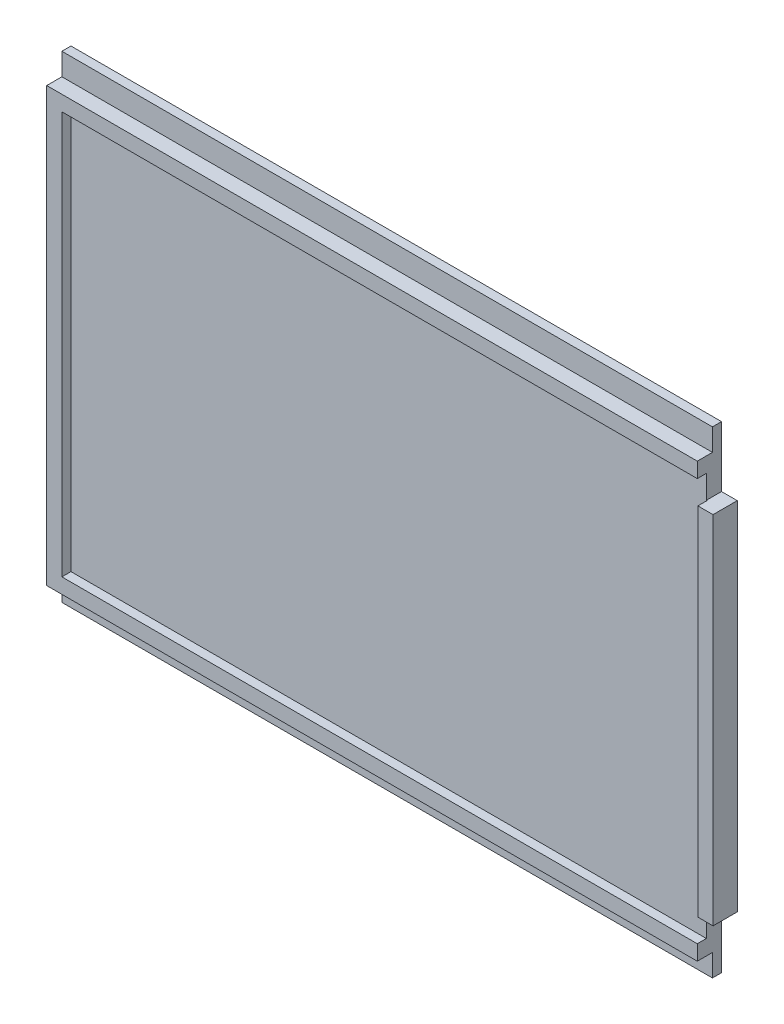
ISO-10303-21;
HEADER;
FILE_DESCRIPTION(('STEP AP214'),'2;1');
FILE_NAME('part.step','',(''),(''),'','','');
FILE_SCHEMA(('AUTOMOTIVE_DESIGN { 1 0 10303 214 1 1 1 1 }'));
ENDSEC;
DATA;
#1=APPLICATION_CONTEXT('core data for automotive mechanical design processes');
#2=APPLICATION_PROTOCOL_DEFINITION('international standard','automotive_design',2000,#1);
#3=PRODUCT_CONTEXT('',#1,'mechanical');
#4=PRODUCT('Part','Part','',(#3));
#5=PRODUCT_RELATED_PRODUCT_CATEGORY('part','',(#4));
#6=PRODUCT_DEFINITION_FORMATION('','',#4);
#7=PRODUCT_DEFINITION_CONTEXT('part definition',#1,'design');
#8=PRODUCT_DEFINITION('design','',#6,#7);
#9=PRODUCT_DEFINITION_SHAPE('','',#8);
#10=(LENGTH_UNIT() NAMED_UNIT(*) SI_UNIT(.MILLI.,.METRE.));
#11=(NAMED_UNIT(*) PLANE_ANGLE_UNIT() SI_UNIT($,.RADIAN.));
#12=(NAMED_UNIT(*) SI_UNIT($,.STERADIAN.) SOLID_ANGLE_UNIT());
#13=UNCERTAINTY_MEASURE_WITH_UNIT(LENGTH_MEASURE(1.E-05),#10,'distance_accuracy_value','');
#14=(GEOMETRIC_REPRESENTATION_CONTEXT(3) GLOBAL_UNCERTAINTY_ASSIGNED_CONTEXT((#13)) GLOBAL_UNIT_ASSIGNED_CONTEXT((#10,
#11,#12)) REPRESENTATION_CONTEXT('',''));
#15=CARTESIAN_POINT('',(0.,0.,0.));
#16=DIRECTION('',(0.,0.,1.));
#17=DIRECTION('',(1.,0.,0.));
#18=AXIS2_PLACEMENT_3D('',#15,#16,#17);
#19=CARTESIAN_POINT('',(0.,0.,5.));
#20=DIRECTION('',(0.,0.,1.));
#21=DIRECTION('',(1.,0.,0.));
#22=AXIS2_PLACEMENT_3D('',#19,#20,#21);
#23=PLANE('',#22);
#24=DIRECTION('',(0.,1.,0.));
#25=VECTOR('',#24,1.);
#26=CARTESIAN_POINT('',(104.8,78.8,5.));
#27=LINE('',#26,#25);
#28=CARTESIAN_POINT('',(104.8,66.5,5.));
#29=VERTEX_POINT('',#28);
#30=CARTESIAN_POINT('',(104.8,71.5,5.));
#31=VERTEX_POINT('',#30);
#32=EDGE_CURVE('E183',#29,#31,#27,.T.);
#33=ORIENTED_EDGE('',*,*,#32,.T.);
#34=DIRECTION('',(-1.,0.,0.));
#35=VECTOR('',#34,1.);
#36=CARTESIAN_POINT('',(-110.,71.5,5.));
#37=LINE('',#36,#35);
#38=CARTESIAN_POINT('',(-110.,71.5,5.));
#39=VERTEX_POINT('',#38);
#40=EDGE_CURVE('E200',#31,#39,#37,.T.);
#41=ORIENTED_EDGE('',*,*,#40,.T.);
#42=DIRECTION('',(0.,-1.,0.));
#43=VECTOR('',#42,1.);
#44=CARTESIAN_POINT('',(-110.,71.5,5.));
#45=LINE('',#44,#43);
#46=CARTESIAN_POINT('',(-110.,-71.5,5.));
#47=VERTEX_POINT('',#46);
#48=EDGE_CURVE('E205',#39,#47,#45,.T.);
#49=ORIENTED_EDGE('',*,*,#48,.T.);
#50=DIRECTION('',(1.,0.,0.));
#51=VECTOR('',#50,1.);
#52=CARTESIAN_POINT('',(-110.,-71.5,5.));
#53=LINE('',#52,#51);
#54=CARTESIAN_POINT('',(104.8,-71.5,5.));
#55=VERTEX_POINT('',#54);
#56=EDGE_CURVE('E216',#47,#55,#53,.T.);
#57=ORIENTED_EDGE('',*,*,#56,.T.);
#58=DIRECTION('',(0.,1.,0.));
#59=VECTOR('',#58,1.);
#60=CARTESIAN_POINT('',(104.8,-58.8,5.));
#61=LINE('',#60,#59);
#62=CARTESIAN_POINT('',(104.8,-66.5,5.));
#63=VERTEX_POINT('',#62);
#64=EDGE_CURVE('E317',#55,#63,#61,.T.);
#65=ORIENTED_EDGE('',*,*,#64,.T.);
#66=DIRECTION('',(1.,0.,0.));
#67=VECTOR('',#66,1.);
#68=CARTESIAN_POINT('',(105.,-66.5,5.));
#69=LINE('',#68,#67);
#70=CARTESIAN_POINT('',(-105.,-66.5,5.));
#71=VERTEX_POINT('',#70);
#72=EDGE_CURVE('E292',#71,#63,#69,.T.);
#73=ORIENTED_EDGE('',*,*,#72,.F.);
#74=DIRECTION('',(0.,-1.,0.));
#75=VECTOR('',#74,1.);
#76=CARTESIAN_POINT('',(-105.,-66.5,5.));
#77=LINE('',#76,#75);
#78=CARTESIAN_POINT('',(-105.,66.5,5.));
#79=VERTEX_POINT('',#78);
#80=EDGE_CURVE('E273',#79,#71,#77,.T.);
#81=ORIENTED_EDGE('',*,*,#80,.F.);
#82=DIRECTION('',(-1.,0.,0.));
#83=VECTOR('',#82,1.);
#84=CARTESIAN_POINT('',(105.,66.5,5.));
#85=LINE('',#84,#83);
#86=EDGE_CURVE('E279',#29,#79,#85,.T.);
#87=ORIENTED_EDGE('',*,*,#86,.F.);
#88=EDGE_LOOP('',(#33,#41,#49,#57,#65,#73,#81,#87));
#89=FACE_BOUND('',#88,.T.);
#90=ADVANCED_FACE('F45',(#89),#23,.T.);
#91=CARTESIAN_POINT('',(110.,71.5,5.));
#92=DIRECTION('',(-1.,0.,0.));
#93=DIRECTION('',(0.,-1.,0.));
#94=AXIS2_PLACEMENT_3D('',#91,#92,#93);
#95=PLANE('',#94);
#96=DIRECTION('',(0.,-1.,0.));
#97=VECTOR('',#96,1.);
#98=CARTESIAN_POINT('',(110.,78.8,-3.));
#99=LINE('',#98,#97);
#100=CARTESIAN_POINT('',(110.,58.8,-3.));
#101=VERTEX_POINT('',#100);
#102=CARTESIAN_POINT('',(110.,-58.8,-3.));
#103=VERTEX_POINT('',#102);
#104=EDGE_CURVE('E192',#101,#103,#99,.T.);
#105=ORIENTED_EDGE('',*,*,#104,.F.);
#106=DIRECTION('',(0.,0.,-1.));
#107=VECTOR('',#106,1.);
#108=CARTESIAN_POINT('',(110.,58.8,5.));
#109=LINE('',#108,#107);
#110=CARTESIAN_POINT('',(110.,58.8,5.));
#111=VERTEX_POINT('',#110);
#112=EDGE_CURVE('E174',#111,#101,#109,.T.);
#113=ORIENTED_EDGE('',*,*,#112,.F.);
#114=DIRECTION('',(0.,1.,0.));
#115=VECTOR('',#114,1.);
#116=CARTESIAN_POINT('',(110.,71.5,5.));
#117=LINE('',#116,#115);
#118=CARTESIAN_POINT('',(110.,-58.8,5.));
#119=VERTEX_POINT('',#118);
#120=EDGE_CURVE('E190',#119,#111,#117,.T.);
#121=ORIENTED_EDGE('',*,*,#120,.F.);
#122=DIRECTION('',(0.,0.,-1.));
#123=VECTOR('',#122,1.);
#124=CARTESIAN_POINT('',(110.,-58.8,5.));
#125=LINE('',#124,#123);
#126=EDGE_CURVE('E396',#119,#103,#125,.T.);
#127=ORIENTED_EDGE('',*,*,#126,.T.);
#128=EDGE_LOOP('',(#105,#113,#121,#127));
#129=FACE_BOUND('',#128,.T.);
#130=ADVANCED_FACE('F47',(#129),#95,.F.);
#131=CARTESIAN_POINT('',(-110.,71.5,5.));
#132=DIRECTION('',(0.,-1.,0.));
#133=DIRECTION('',(0.,0.,-1.));
#134=AXIS2_PLACEMENT_3D('',#131,#132,#133);
#135=PLANE('',#134);
#136=ORIENTED_EDGE('',*,*,#40,.F.);
#137=DIRECTION('',(0.,0.,-1.));
#138=VECTOR('',#137,1.);
#139=CARTESIAN_POINT('',(104.8,71.5,5.));
#140=LINE('',#139,#138);
#141=CARTESIAN_POINT('',(104.8,71.5,0.));
#142=VERTEX_POINT('',#141);
#143=EDGE_CURVE('E242',#31,#142,#140,.T.);
#144=ORIENTED_EDGE('',*,*,#143,.T.);
#145=DIRECTION('',(-1.,0.,0.));
#146=VECTOR('',#145,1.);
#147=CARTESIAN_POINT('',(-110.,71.5,0.));
#148=LINE('',#147,#146);
#149=CARTESIAN_POINT('',(-110.,71.5,0.));
#150=VERTEX_POINT('',#149);
#151=EDGE_CURVE('E208',#142,#150,#148,.T.);
#152=ORIENTED_EDGE('',*,*,#151,.T.);
#153=DIRECTION('',(0.,0.,-1.));
#154=VECTOR('',#153,1.);
#155=CARTESIAN_POINT('',(-110.,71.5,5.));
#156=LINE('',#155,#154);
#157=EDGE_CURVE('E54',#39,#150,#156,.T.);
#158=ORIENTED_EDGE('',*,*,#157,.F.);
#159=EDGE_LOOP('',(#136,#144,#152,#158));
#160=FACE_BOUND('',#159,.T.);
#161=ADVANCED_FACE('F239',(#160),#135,.F.);
#162=CARTESIAN_POINT('',(-110.,71.5,5.));
#163=DIRECTION('',(1.,0.,0.));
#164=DIRECTION('',(0.,1.,0.));
#165=AXIS2_PLACEMENT_3D('',#162,#163,#164);
#166=PLANE('',#165);
#167=ORIENTED_EDGE('',*,*,#157,.T.);
#168=DIRECTION('',(0.,1.,0.));
#169=VECTOR('',#168,1.);
#170=CARTESIAN_POINT('',(-110.,78.8,0.));
#171=LINE('',#170,#169);
#172=CARTESIAN_POINT('',(-110.,78.8,0.));
#173=VERTEX_POINT('',#172);
#174=EDGE_CURVE('E234',#150,#173,#171,.T.);
#175=ORIENTED_EDGE('',*,*,#174,.T.);
#176=DIRECTION('',(0.,0.,1.));
#177=VECTOR('',#176,1.);
#178=CARTESIAN_POINT('',(-110.,78.8,-3.));
#179=LINE('',#178,#177);
#180=CARTESIAN_POINT('',(-110.,78.8,-3.));
#181=VERTEX_POINT('',#180);
#182=EDGE_CURVE('E270',#181,#173,#179,.T.);
#183=ORIENTED_EDGE('',*,*,#182,.F.);
#184=DIRECTION('',(0.,1.,0.));
#185=VECTOR('',#184,1.);
#186=CARTESIAN_POINT('',(-110.,78.8,-3.));
#187=LINE('',#186,#185);
#188=CARTESIAN_POINT('',(-110.,-78.8,-3.));
#189=VERTEX_POINT('',#188);
#190=EDGE_CURVE('E265',#189,#181,#187,.T.);
#191=ORIENTED_EDGE('',*,*,#190,.F.);
#192=DIRECTION('',(0.,0.,1.));
#193=VECTOR('',#192,1.);
#194=CARTESIAN_POINT('',(-110.,-78.8,-3.));
#195=LINE('',#194,#193);
#196=CARTESIAN_POINT('',(-110.,-78.8,0.));
#197=VERTEX_POINT('',#196);
#198=EDGE_CURVE('E266',#189,#197,#195,.T.);
#199=ORIENTED_EDGE('',*,*,#198,.T.);
#200=CARTESIAN_POINT('',(-110.,-71.5,0.));
#201=VERTEX_POINT('',#200);
#202=EDGE_CURVE('E249',#197,#201,#171,.T.);
#203=ORIENTED_EDGE('',*,*,#202,.T.);
#204=DIRECTION('',(0.,0.,-1.));
#205=VECTOR('',#204,1.);
#206=CARTESIAN_POINT('',(-110.,-71.5,5.));
#207=LINE('',#206,#205);
#208=EDGE_CURVE('E220',#47,#201,#207,.T.);
#209=ORIENTED_EDGE('',*,*,#208,.F.);
#210=ORIENTED_EDGE('',*,*,#48,.F.);
#211=EDGE_LOOP('',(#167,#175,#183,#191,#199,#203,#209,#210));
#212=FACE_BOUND('',#211,.T.);
#213=ADVANCED_FACE('F231',(#212),#166,.F.);
#214=CARTESIAN_POINT('',(-110.,-71.5,5.));
#215=DIRECTION('',(0.,1.,0.));
#216=DIRECTION('',(0.,0.,1.));
#217=AXIS2_PLACEMENT_3D('',#214,#215,#216);
#218=PLANE('',#217);
#219=DIRECTION('',(1.,0.,0.));
#220=VECTOR('',#219,1.);
#221=CARTESIAN_POINT('',(-110.,-71.5,0.));
#222=LINE('',#221,#220);
#223=CARTESIAN_POINT('',(104.8,-71.5,0.));
#224=VERTEX_POINT('',#223);
#225=EDGE_CURVE('E201',#201,#224,#222,.T.);
#226=ORIENTED_EDGE('',*,*,#225,.T.);
#227=DIRECTION('',(0.,0.,1.));
#228=VECTOR('',#227,1.);
#229=CARTESIAN_POINT('',(104.8,-71.5,5.));
#230=LINE('',#229,#228);
#231=EDGE_CURVE('E350',#224,#55,#230,.T.);
#232=ORIENTED_EDGE('',*,*,#231,.T.);
#233=ORIENTED_EDGE('',*,*,#56,.F.);
#234=ORIENTED_EDGE('',*,*,#208,.T.);
#235=EDGE_LOOP('',(#226,#232,#233,#234));
#236=FACE_BOUND('',#235,.T.);
#237=ADVANCED_FACE('F406',(#236),#218,.F.);
#238=DIRECTION('',(-1.,0.,0.));
#239=VECTOR('',#238,1.);
#240=CARTESIAN_POINT('',(104.8,58.8,5.));
#241=LINE('',#240,#239);
#242=CARTESIAN_POINT('',(105.,58.8,5.));
#243=VERTEX_POINT('',#242);
#244=EDGE_CURVE('E170',#111,#243,#241,.T.);
#245=ORIENTED_EDGE('',*,*,#244,.T.);
#246=DIRECTION('',(0.,1.,0.));
#247=VECTOR('',#246,1.);
#248=CARTESIAN_POINT('',(105.,-66.5,5.));
#249=LINE('',#248,#247);
#250=CARTESIAN_POINT('',(105.,-58.8,5.));
#251=VERTEX_POINT('',#250);
#252=EDGE_CURVE('E296',#251,#243,#249,.T.);
#253=ORIENTED_EDGE('',*,*,#252,.F.);
#254=DIRECTION('',(1.,0.,0.));
#255=VECTOR('',#254,1.);
#256=CARTESIAN_POINT('',(110.,-58.8,5.));
#257=LINE('',#256,#255);
#258=EDGE_CURVE('E198',#251,#119,#257,.T.);
#259=ORIENTED_EDGE('',*,*,#258,.T.);
#260=ORIENTED_EDGE('',*,*,#120,.T.);
#261=EDGE_LOOP('',(#245,#253,#259,#260));
#262=FACE_BOUND('',#261,.T.);
#263=ADVANCED_FACE('F197',(#262),#23,.T.);
#264=CARTESIAN_POINT('',(-105.,-66.5,2.));
#265=DIRECTION('',(-1.,0.,0.));
#266=DIRECTION('',(0.,0.,1.));
#267=AXIS2_PLACEMENT_3D('',#264,#265,#266);
#268=PLANE('',#267);
#269=ORIENTED_EDGE('',*,*,#80,.T.);
#270=DIRECTION('',(0.,0.,1.));
#271=VECTOR('',#270,1.);
#272=CARTESIAN_POINT('',(-105.,-66.5,2.));
#273=LINE('',#272,#271);
#274=CARTESIAN_POINT('',(-105.,-66.5,2.));
#275=VERTEX_POINT('',#274);
#276=EDGE_CURVE('E211',#275,#71,#273,.T.);
#277=ORIENTED_EDGE('',*,*,#276,.F.);
#278=DIRECTION('',(0.,-1.,0.));
#279=VECTOR('',#278,1.);
#280=CARTESIAN_POINT('',(-105.,-66.5,2.));
#281=LINE('',#280,#279);
#282=CARTESIAN_POINT('',(-105.,66.5,2.));
#283=VERTEX_POINT('',#282);
#284=EDGE_CURVE('E274',#283,#275,#281,.T.);
#285=ORIENTED_EDGE('',*,*,#284,.F.);
#286=DIRECTION('',(0.,0.,1.));
#287=VECTOR('',#286,1.);
#288=CARTESIAN_POINT('',(-105.,66.5,2.));
#289=LINE('',#288,#287);
#290=EDGE_CURVE('E222',#283,#79,#289,.T.);
#291=ORIENTED_EDGE('',*,*,#290,.T.);
#292=EDGE_LOOP('',(#269,#277,#285,#291));
#293=FACE_BOUND('',#292,.T.);
#294=ADVANCED_FACE('F413',(#293),#268,.F.);
#295=CARTESIAN_POINT('',(105.,66.5,2.));
#296=DIRECTION('',(0.,1.,0.));
#297=DIRECTION('',(0.,0.,1.));
#298=AXIS2_PLACEMENT_3D('',#295,#296,#297);
#299=PLANE('',#298);
#300=DIRECTION('',(-1.,0.,0.));
#301=VECTOR('',#300,1.);
#302=CARTESIAN_POINT('',(105.,66.5,2.));
#303=LINE('',#302,#301);
#304=CARTESIAN_POINT('',(104.8,66.5,2.));
#305=VERTEX_POINT('',#304);
#306=EDGE_CURVE('E287',#305,#283,#303,.T.);
#307=ORIENTED_EDGE('',*,*,#306,.F.);
#308=DIRECTION('',(0.,0.,1.));
#309=VECTOR('',#308,1.);
#310=CARTESIAN_POINT('',(104.8,66.5,2.));
#311=LINE('',#310,#309);
#312=EDGE_CURVE('E335',#305,#29,#311,.T.);
#313=ORIENTED_EDGE('',*,*,#312,.T.);
#314=ORIENTED_EDGE('',*,*,#86,.T.);
#315=ORIENTED_EDGE('',*,*,#290,.F.);
#316=EDGE_LOOP('',(#307,#313,#314,#315));
#317=FACE_BOUND('',#316,.T.);
#318=ADVANCED_FACE('F424',(#317),#299,.F.);
#319=CARTESIAN_POINT('',(105.,-66.5,2.));
#320=DIRECTION('',(1.,0.,0.));
#321=DIRECTION('',(0.,0.,-1.));
#322=AXIS2_PLACEMENT_3D('',#319,#320,#321);
#323=PLANE('',#322);
#324=ORIENTED_EDGE('',*,*,#252,.T.);
#325=DIRECTION('',(0.,0.,-1.));
#326=VECTOR('',#325,1.);
#327=CARTESIAN_POINT('',(105.,58.8,2.));
#328=LINE('',#327,#326);
#329=CARTESIAN_POINT('',(105.,58.8,2.));
#330=VERTEX_POINT('',#329);
#331=EDGE_CURVE('E177',#243,#330,#328,.T.);
#332=ORIENTED_EDGE('',*,*,#331,.T.);
#333=DIRECTION('',(0.,1.,0.));
#334=VECTOR('',#333,1.);
#335=CARTESIAN_POINT('',(105.,-66.5,2.));
#336=LINE('',#335,#334);
#337=CARTESIAN_POINT('',(105.,-58.8,2.));
#338=VERTEX_POINT('',#337);
#339=EDGE_CURVE('E283',#338,#330,#336,.T.);
#340=ORIENTED_EDGE('',*,*,#339,.F.);
#341=DIRECTION('',(0.,0.,1.));
#342=VECTOR('',#341,1.);
#343=CARTESIAN_POINT('',(105.,-58.8,2.));
#344=LINE('',#343,#342);
#345=EDGE_CURVE('E342',#338,#251,#344,.T.);
#346=ORIENTED_EDGE('',*,*,#345,.T.);
#347=EDGE_LOOP('',(#324,#332,#340,#346));
#348=FACE_BOUND('',#347,.T.);
#349=ADVANCED_FACE('F428',(#348),#323,.F.);
#350=CARTESIAN_POINT('',(105.,-66.5,2.));
#351=DIRECTION('',(0.,-1.,0.));
#352=DIRECTION('',(0.,0.,-1.));
#353=AXIS2_PLACEMENT_3D('',#350,#351,#352);
#354=PLANE('',#353);
#355=ORIENTED_EDGE('',*,*,#72,.T.);
#356=DIRECTION('',(0.,0.,-1.));
#357=VECTOR('',#356,1.);
#358=CARTESIAN_POINT('',(104.8,-66.5,2.));
#359=LINE('',#358,#357);
#360=CARTESIAN_POINT('',(104.8,-66.5,2.));
#361=VERTEX_POINT('',#360);
#362=EDGE_CURVE('E356',#63,#361,#359,.T.);
#363=ORIENTED_EDGE('',*,*,#362,.T.);
#364=DIRECTION('',(1.,0.,0.));
#365=VECTOR('',#364,1.);
#366=CARTESIAN_POINT('',(105.,-66.5,2.));
#367=LINE('',#366,#365);
#368=EDGE_CURVE('E278',#275,#361,#367,.T.);
#369=ORIENTED_EDGE('',*,*,#368,.F.);
#370=ORIENTED_EDGE('',*,*,#276,.T.);
#371=EDGE_LOOP('',(#355,#363,#369,#370));
#372=FACE_BOUND('',#371,.T.);
#373=ADVANCED_FACE('F311',(#372),#354,.F.);
#374=CARTESIAN_POINT('',(0.,0.,2.));
#375=DIRECTION('',(0.,0.,1.));
#376=DIRECTION('',(1.,0.,0.));
#377=AXIS2_PLACEMENT_3D('',#374,#375,#376);
#378=PLANE('',#377);
#379=DIRECTION('',(0.,-1.,0.));
#380=VECTOR('',#379,1.);
#381=CARTESIAN_POINT('',(104.8,0.,2.));
#382=LINE('',#381,#380);
#383=CARTESIAN_POINT('',(104.8,58.8,2.));
#384=VERTEX_POINT('',#383);
#385=EDGE_CURVE('E332',#305,#384,#382,.T.);
#386=ORIENTED_EDGE('',*,*,#385,.F.);
#387=ORIENTED_EDGE('',*,*,#306,.T.);
#388=ORIENTED_EDGE('',*,*,#284,.T.);
#389=ORIENTED_EDGE('',*,*,#368,.T.);
#390=DIRECTION('',(0.,-1.,0.));
#391=VECTOR('',#390,1.);
#392=CARTESIAN_POINT('',(104.8,0.,2.));
#393=LINE('',#392,#391);
#394=CARTESIAN_POINT('',(104.8,-58.8,2.));
#395=VERTEX_POINT('',#394);
#396=EDGE_CURVE('E353',#395,#361,#393,.T.);
#397=ORIENTED_EDGE('',*,*,#396,.F.);
#398=DIRECTION('',(-1.,0.,0.));
#399=VECTOR('',#398,1.);
#400=CARTESIAN_POINT('',(0.,-58.8,2.));
#401=LINE('',#400,#399);
#402=EDGE_CURVE('E339',#338,#395,#401,.T.);
#403=ORIENTED_EDGE('',*,*,#402,.F.);
#404=ORIENTED_EDGE('',*,*,#339,.T.);
#405=DIRECTION('',(1.,0.,0.));
#406=VECTOR('',#405,1.);
#407=CARTESIAN_POINT('',(0.,58.8,2.));
#408=LINE('',#407,#406);
#409=EDGE_CURVE('E254',#384,#330,#408,.T.);
#410=ORIENTED_EDGE('',*,*,#409,.F.);
#411=EDGE_LOOP('',(#386,#387,#388,#389,#397,#403,#404,#410));
#412=FACE_BOUND('',#411,.T.);
#413=ADVANCED_FACE('F427',(#412),#378,.T.);
#414=CARTESIAN_POINT('',(0.,0.,0.));
#415=DIRECTION('',(0.,0.,-1.));
#416=DIRECTION('',(-1.,0.,0.));
#417=AXIS2_PLACEMENT_3D('',#414,#415,#416);
#418=PLANE('',#417);
#419=DIRECTION('',(-1.,0.,0.));
#420=VECTOR('',#419,1.);
#421=CARTESIAN_POINT('',(110.,-78.8,0.));
#422=LINE('',#421,#420);
#423=CARTESIAN_POINT('',(104.8,-78.8,0.));
#424=VERTEX_POINT('',#423);
#425=EDGE_CURVE('E262',#424,#197,#422,.T.);
#426=ORIENTED_EDGE('',*,*,#425,.F.);
#427=DIRECTION('',(0.,1.,0.));
#428=VECTOR('',#427,1.);
#429=CARTESIAN_POINT('',(104.8,0.,0.));
#430=LINE('',#429,#428);
#431=EDGE_CURVE('E346',#424,#224,#430,.T.);
#432=ORIENTED_EDGE('',*,*,#431,.T.);
#433=ORIENTED_EDGE('',*,*,#225,.F.);
#434=ORIENTED_EDGE('',*,*,#202,.F.);
#435=EDGE_LOOP('',(#426,#432,#433,#434));
#436=FACE_BOUND('',#435,.T.);
#437=ADVANCED_FACE('F404',(#436),#418,.F.);
#438=CARTESIAN_POINT('',(110.,78.8,-3.));
#439=DIRECTION('',(0.,-1.,0.));
#440=DIRECTION('',(0.,0.,-1.));
#441=AXIS2_PLACEMENT_3D('',#438,#439,#440);
#442=PLANE('',#441);
#443=DIRECTION('',(1.,0.,0.));
#444=VECTOR('',#443,1.);
#445=CARTESIAN_POINT('',(110.,78.8,0.));
#446=LINE('',#445,#444);
#447=CARTESIAN_POINT('',(104.8,78.8,0.));
#448=VERTEX_POINT('',#447);
#449=EDGE_CURVE('E246',#173,#448,#446,.T.);
#450=ORIENTED_EDGE('',*,*,#449,.T.);
#451=DIRECTION('',(0.,0.,-1.));
#452=VECTOR('',#451,1.);
#453=CARTESIAN_POINT('',(104.8,78.8,5.));
#454=LINE('',#453,#452);
#455=CARTESIAN_POINT('',(104.8,78.8,-3.));
#456=VERTEX_POINT('',#455);
#457=EDGE_CURVE('E69',#448,#456,#454,.T.);
#458=ORIENTED_EDGE('',*,*,#457,.T.);
#459=DIRECTION('',(1.,0.,0.));
#460=VECTOR('',#459,1.);
#461=CARTESIAN_POINT('',(110.,78.8,-3.));
#462=LINE('',#461,#460);
#463=EDGE_CURVE('E364',#181,#456,#462,.T.);
#464=ORIENTED_EDGE('',*,*,#463,.F.);
#465=ORIENTED_EDGE('',*,*,#182,.T.);
#466=EDGE_LOOP('',(#450,#458,#464,#465));
#467=FACE_BOUND('',#466,.T.);
#468=ADVANCED_FACE('F382',(#467),#442,.F.);
#469=CARTESIAN_POINT('',(110.,-78.8,-3.));
#470=DIRECTION('',(0.,1.,0.));
#471=DIRECTION('',(0.,0.,1.));
#472=AXIS2_PLACEMENT_3D('',#469,#470,#471);
#473=PLANE('',#472);
#474=DIRECTION('',(-1.,0.,0.));
#475=VECTOR('',#474,1.);
#476=CARTESIAN_POINT('',(110.,-78.8,-3.));
#477=LINE('',#476,#475);
#478=CARTESIAN_POINT('',(104.8,-78.8,-3.));
#479=VERTEX_POINT('',#478);
#480=EDGE_CURVE('E258',#479,#189,#477,.T.);
#481=ORIENTED_EDGE('',*,*,#480,.F.);
#482=DIRECTION('',(0.,0.,-1.));
#483=VECTOR('',#482,1.);
#484=CARTESIAN_POINT('',(104.8,-78.8,5.));
#485=LINE('',#484,#483);
#486=EDGE_CURVE('E399',#424,#479,#485,.T.);
#487=ORIENTED_EDGE('',*,*,#486,.F.);
#488=ORIENTED_EDGE('',*,*,#425,.T.);
#489=ORIENTED_EDGE('',*,*,#198,.F.);
#490=EDGE_LOOP('',(#481,#487,#488,#489));
#491=FACE_BOUND('',#490,.T.);
#492=ADVANCED_FACE('F378',(#491),#473,.F.);
#493=CARTESIAN_POINT('',(0.,0.,-3.));
#494=DIRECTION('',(0.,0.,-1.));
#495=DIRECTION('',(-1.,0.,0.));
#496=AXIS2_PLACEMENT_3D('',#493,#494,#495);
#497=PLANE('',#496);
#498=DIRECTION('',(0.,1.,0.));
#499=VECTOR('',#498,1.);
#500=CARTESIAN_POINT('',(104.8,78.8,-3.));
#501=LINE('',#500,#499);
#502=CARTESIAN_POINT('',(104.8,58.8,-3.));
#503=VERTEX_POINT('',#502);
#504=EDGE_CURVE('E184',#503,#456,#501,.T.);
#505=ORIENTED_EDGE('',*,*,#504,.F.);
#506=DIRECTION('',(-1.,0.,0.));
#507=VECTOR('',#506,1.);
#508=CARTESIAN_POINT('',(104.8,58.8,-3.));
#509=LINE('',#508,#507);
#510=EDGE_CURVE('E383',#101,#503,#509,.T.);
#511=ORIENTED_EDGE('',*,*,#510,.F.);
#512=ORIENTED_EDGE('',*,*,#104,.T.);
#513=DIRECTION('',(1.,0.,0.));
#514=VECTOR('',#513,1.);
#515=CARTESIAN_POINT('',(110.,-58.8,-3.));
#516=LINE('',#515,#514);
#517=CARTESIAN_POINT('',(104.8,-58.8,-3.));
#518=VERTEX_POINT('',#517);
#519=EDGE_CURVE('E321',#518,#103,#516,.T.);
#520=ORIENTED_EDGE('',*,*,#519,.F.);
#521=DIRECTION('',(0.,1.,0.));
#522=VECTOR('',#521,1.);
#523=CARTESIAN_POINT('',(104.8,-58.8,-3.));
#524=LINE('',#523,#522);
#525=EDGE_CURVE('E61',#479,#518,#524,.T.);
#526=ORIENTED_EDGE('',*,*,#525,.F.);
#527=ORIENTED_EDGE('',*,*,#480,.T.);
#528=ORIENTED_EDGE('',*,*,#190,.T.);
#529=ORIENTED_EDGE('',*,*,#463,.T.);
#530=EDGE_LOOP('',(#505,#511,#512,#520,#526,#527,#528,#529));
#531=FACE_BOUND('',#530,.T.);
#532=ADVANCED_FACE('F374',(#531),#497,.T.);
#533=ORIENTED_EDGE('',*,*,#151,.F.);
#534=DIRECTION('',(0.,1.,0.));
#535=VECTOR('',#534,1.);
#536=CARTESIAN_POINT('',(104.8,0.,0.));
#537=LINE('',#536,#535);
#538=EDGE_CURVE('E11',#142,#448,#537,.T.);
#539=ORIENTED_EDGE('',*,*,#538,.T.);
#540=ORIENTED_EDGE('',*,*,#449,.F.);
#541=ORIENTED_EDGE('',*,*,#174,.F.);
#542=EDGE_LOOP('',(#533,#539,#540,#541));
#543=FACE_BOUND('',#542,.T.);
#544=ADVANCED_FACE('F244',(#543),#418,.F.);
#545=CARTESIAN_POINT('',(104.8,58.8,5.));
#546=DIRECTION('',(0.,-1.,0.));
#547=DIRECTION('',(0.,0.,-1.));
#548=AXIS2_PLACEMENT_3D('',#545,#546,#547);
#549=PLANE('',#548);
#550=ORIENTED_EDGE('',*,*,#244,.F.);
#551=ORIENTED_EDGE('',*,*,#112,.T.);
#552=ORIENTED_EDGE('',*,*,#510,.T.);
#553=DIRECTION('',(0.,0.,-1.));
#554=VECTOR('',#553,1.);
#555=CARTESIAN_POINT('',(104.8,58.8,5.));
#556=LINE('',#555,#554);
#557=EDGE_CURVE('E194',#384,#503,#556,.T.);
#558=ORIENTED_EDGE('',*,*,#557,.F.);
#559=ORIENTED_EDGE('',*,*,#409,.T.);
#560=ORIENTED_EDGE('',*,*,#331,.F.);
#561=EDGE_LOOP('',(#550,#551,#552,#558,#559,#560));
#562=FACE_BOUND('',#561,.T.);
#563=ADVANCED_FACE('F172',(#562),#549,.F.);
#564=CARTESIAN_POINT('',(104.8,78.8,5.));
#565=DIRECTION('',(-1.,0.,0.));
#566=DIRECTION('',(0.,-1.,0.));
#567=AXIS2_PLACEMENT_3D('',#564,#565,#566);
#568=PLANE('',#567);
#569=ORIENTED_EDGE('',*,*,#385,.T.);
#570=ORIENTED_EDGE('',*,*,#557,.T.);
#571=ORIENTED_EDGE('',*,*,#504,.T.);
#572=ORIENTED_EDGE('',*,*,#457,.F.);
#573=ORIENTED_EDGE('',*,*,#538,.F.);
#574=ORIENTED_EDGE('',*,*,#143,.F.);
#575=ORIENTED_EDGE('',*,*,#32,.F.);
#576=ORIENTED_EDGE('',*,*,#312,.F.);
#577=EDGE_LOOP('',(#569,#570,#571,#572,#573,#574,#575,#576));
#578=FACE_BOUND('',#577,.T.);
#579=ADVANCED_FACE('F452',(#578),#568,.F.);
#580=CARTESIAN_POINT('',(104.8,-58.8,5.));
#581=DIRECTION('',(-1.,0.,0.));
#582=DIRECTION('',(0.,0.,1.));
#583=AXIS2_PLACEMENT_3D('',#580,#581,#582);
#584=PLANE('',#583);
#585=ORIENTED_EDGE('',*,*,#64,.F.);
#586=ORIENTED_EDGE('',*,*,#231,.F.);
#587=ORIENTED_EDGE('',*,*,#431,.F.);
#588=ORIENTED_EDGE('',*,*,#486,.T.);
#589=ORIENTED_EDGE('',*,*,#525,.T.);
#590=DIRECTION('',(0.,0.,-1.));
#591=VECTOR('',#590,1.);
#592=CARTESIAN_POINT('',(104.8,-58.8,5.));
#593=LINE('',#592,#591);
#594=EDGE_CURVE('E326',#395,#518,#593,.T.);
#595=ORIENTED_EDGE('',*,*,#594,.F.);
#596=ORIENTED_EDGE('',*,*,#396,.T.);
#597=ORIENTED_EDGE('',*,*,#362,.F.);
#598=EDGE_LOOP('',(#585,#586,#587,#588,#589,#595,#596,#597));
#599=FACE_BOUND('',#598,.T.);
#600=ADVANCED_FACE('F402',(#599),#584,.F.);
#601=CARTESIAN_POINT('',(110.,-58.8,5.));
#602=DIRECTION('',(0.,1.,0.));
#603=DIRECTION('',(0.,0.,1.));
#604=AXIS2_PLACEMENT_3D('',#601,#602,#603);
#605=PLANE('',#604);
#606=ORIENTED_EDGE('',*,*,#402,.T.);
#607=ORIENTED_EDGE('',*,*,#594,.T.);
#608=ORIENTED_EDGE('',*,*,#519,.T.);
#609=ORIENTED_EDGE('',*,*,#126,.F.);
#610=ORIENTED_EDGE('',*,*,#258,.F.);
#611=ORIENTED_EDGE('',*,*,#345,.F.);
#612=EDGE_LOOP('',(#606,#607,#608,#609,#610,#611));
#613=FACE_BOUND('',#612,.T.);
#614=ADVANCED_FACE('F446',(#613),#605,.F.);
#615=CLOSED_SHELL('',(#90,#130,#161,#213,#237,#263,#294,#318,#349,#373,#413,#437,#468,#492,#532,
#544,#563,#579,#600,#614));
#616=MANIFOLD_SOLID_BREP('B2',#615);
#617=ADVANCED_BREP_SHAPE_REPRESENTATION('',(#18,#616),#14);
#618=SHAPE_DEFINITION_REPRESENTATION(#9,#617);
ENDSEC;
END-ISO-10303-21;
